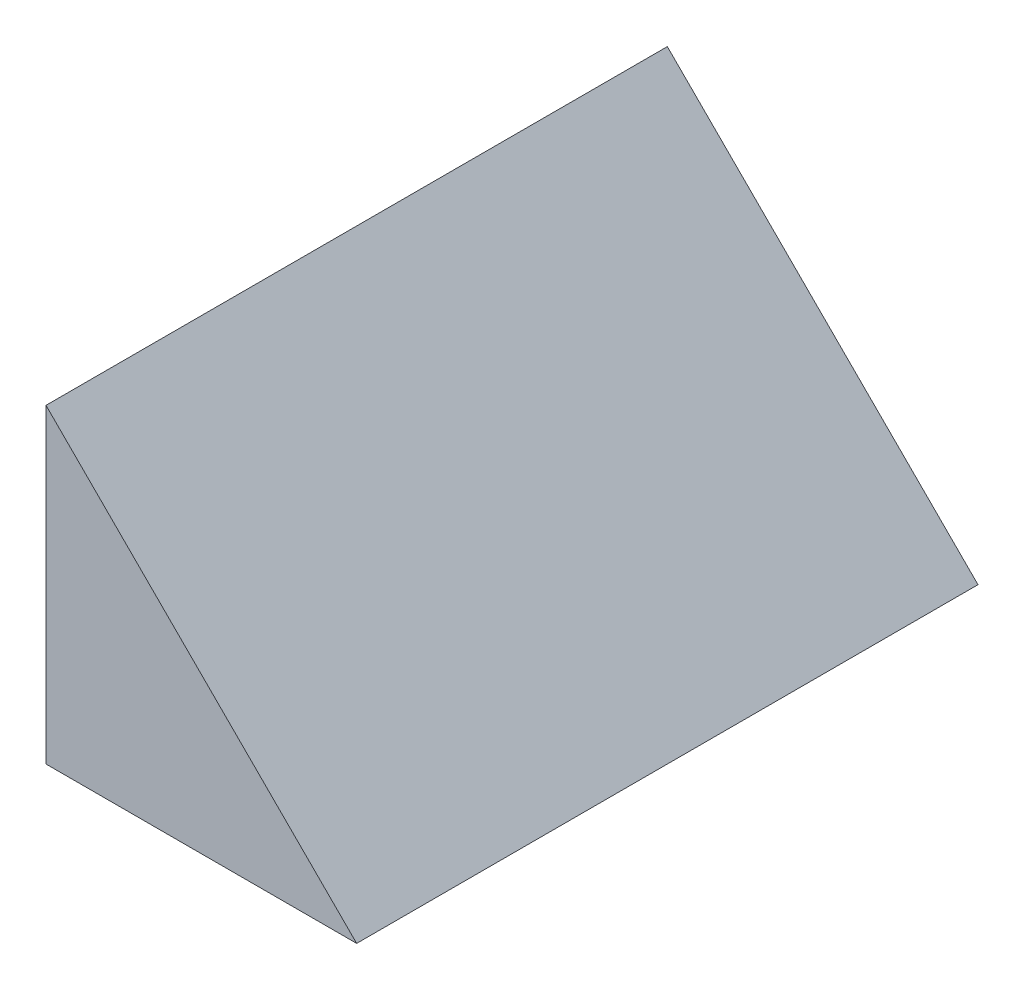
ISO-10303-21;
HEADER;
FILE_DESCRIPTION(('STEP AP214'),'2;1');
FILE_NAME('part.step','',(''),(''),'','','');
FILE_SCHEMA(('AUTOMOTIVE_DESIGN { 1 0 10303 214 1 1 1 1 }'));
ENDSEC;
DATA;
#1=APPLICATION_CONTEXT('core data for automotive mechanical design processes');
#2=APPLICATION_PROTOCOL_DEFINITION('international standard','automotive_design',2000,#1);
#3=PRODUCT_CONTEXT('',#1,'mechanical');
#4=PRODUCT('Part','Part','',(#3));
#5=PRODUCT_RELATED_PRODUCT_CATEGORY('part','',(#4));
#6=PRODUCT_DEFINITION_FORMATION('','',#4);
#7=PRODUCT_DEFINITION_CONTEXT('part definition',#1,'design');
#8=PRODUCT_DEFINITION('design','',#6,#7);
#9=PRODUCT_DEFINITION_SHAPE('','',#8);
#10=(LENGTH_UNIT() NAMED_UNIT(*) SI_UNIT(.MILLI.,.METRE.));
#11=(NAMED_UNIT(*) PLANE_ANGLE_UNIT() SI_UNIT($,.RADIAN.));
#12=(NAMED_UNIT(*) SI_UNIT($,.STERADIAN.) SOLID_ANGLE_UNIT());
#13=UNCERTAINTY_MEASURE_WITH_UNIT(LENGTH_MEASURE(1.E-05),#10,'distance_accuracy_value','');
#14=(GEOMETRIC_REPRESENTATION_CONTEXT(3) GLOBAL_UNCERTAINTY_ASSIGNED_CONTEXT((#13)) GLOBAL_UNIT_ASSIGNED_CONTEXT((#10,
#11,#12)) REPRESENTATION_CONTEXT('',''));
#15=CARTESIAN_POINT('',(0.,0.,0.));
#16=DIRECTION('',(0.,0.,1.));
#17=DIRECTION('',(1.,0.,0.));
#18=AXIS2_PLACEMENT_3D('',#15,#16,#17);
#19=CARTESIAN_POINT('',(0.,6.35,12.7));
#20=DIRECTION('',(1.,0.,0.));
#21=DIRECTION('',(0.,1.,0.));
#22=AXIS2_PLACEMENT_3D('',#19,#20,#21);
#23=PLANE('',#22);
#24=DIRECTION('',(0.,-1.,0.));
#25=VECTOR('',#24,1.);
#26=CARTESIAN_POINT('',(0.,6.35,0.));
#27=LINE('',#26,#25);
#28=CARTESIAN_POINT('',(0.,6.35,0.));
#29=VERTEX_POINT('',#28);
#30=CARTESIAN_POINT('',(0.,0.,0.));
#31=VERTEX_POINT('',#30);
#32=EDGE_CURVE('E79',#29,#31,#27,.T.);
#33=ORIENTED_EDGE('',*,*,#32,.T.);
#34=DIRECTION('',(0.,0.,-1.));
#35=VECTOR('',#34,1.);
#36=CARTESIAN_POINT('',(0.,0.,12.7));
#37=LINE('',#36,#35);
#38=CARTESIAN_POINT('',(0.,0.,12.7));
#39=VERTEX_POINT('',#38);
#40=EDGE_CURVE('E11',#39,#31,#37,.T.);
#41=ORIENTED_EDGE('',*,*,#40,.F.);
#42=DIRECTION('',(0.,-1.,0.));
#43=VECTOR('',#42,1.);
#44=CARTESIAN_POINT('',(0.,6.35,12.7));
#45=LINE('',#44,#43);
#46=CARTESIAN_POINT('',(0.,6.35,12.7));
#47=VERTEX_POINT('',#46);
#48=EDGE_CURVE('E72',#47,#39,#45,.T.);
#49=ORIENTED_EDGE('',*,*,#48,.F.);
#50=DIRECTION('',(0.,0.,-1.));
#51=VECTOR('',#50,1.);
#52=CARTESIAN_POINT('',(0.,6.35,12.7));
#53=LINE('',#52,#51);
#54=EDGE_CURVE('E80',#47,#29,#53,.T.);
#55=ORIENTED_EDGE('',*,*,#54,.T.);
#56=EDGE_LOOP('',(#33,#41,#49,#55));
#57=FACE_BOUND('',#56,.T.);
#58=ADVANCED_FACE('F32',(#57),#23,.F.);
#59=CARTESIAN_POINT('',(0.,0.,12.7));
#60=DIRECTION('',(0.,1.,0.));
#61=DIRECTION('',(0.,0.,1.));
#62=AXIS2_PLACEMENT_3D('',#59,#60,#61);
#63=PLANE('',#62);
#64=DIRECTION('',(1.,0.,0.));
#65=VECTOR('',#64,1.);
#66=CARTESIAN_POINT('',(0.,0.,0.));
#67=LINE('',#66,#65);
#68=CARTESIAN_POINT('',(6.35,0.,0.));
#69=VERTEX_POINT('',#68);
#70=EDGE_CURVE('E60',#31,#69,#67,.T.);
#71=ORIENTED_EDGE('',*,*,#70,.T.);
#72=DIRECTION('',(0.,0.,-1.));
#73=VECTOR('',#72,1.);
#74=CARTESIAN_POINT('',(6.35,0.,12.7));
#75=LINE('',#74,#73);
#76=CARTESIAN_POINT('',(6.35,0.,12.7));
#77=VERTEX_POINT('',#76);
#78=EDGE_CURVE('E40',#77,#69,#75,.T.);
#79=ORIENTED_EDGE('',*,*,#78,.F.);
#80=DIRECTION('',(1.,0.,0.));
#81=VECTOR('',#80,1.);
#82=CARTESIAN_POINT('',(0.,0.,12.7));
#83=LINE('',#82,#81);
#84=EDGE_CURVE('E68',#39,#77,#83,.T.);
#85=ORIENTED_EDGE('',*,*,#84,.F.);
#86=ORIENTED_EDGE('',*,*,#40,.T.);
#87=EDGE_LOOP('',(#71,#79,#85,#86));
#88=FACE_BOUND('',#87,.T.);
#89=ADVANCED_FACE('F69',(#88),#63,.F.);
#90=CARTESIAN_POINT('',(6.35,0.,12.7));
#91=DIRECTION('',(-0.707106781186548,-0.707106781186547,0.));
#92=DIRECTION('',(0.707106781186547,-0.707106781186548,0.));
#93=AXIS2_PLACEMENT_3D('',#90,#91,#92);
#94=PLANE('',#93);
#95=DIRECTION('',(-0.707106781186547,0.707106781186548,0.));
#96=VECTOR('',#95,1.);
#97=CARTESIAN_POINT('',(6.35,0.,0.));
#98=LINE('',#97,#96);
#99=EDGE_CURVE('E65',#69,#29,#98,.T.);
#100=ORIENTED_EDGE('',*,*,#99,.T.);
#101=ORIENTED_EDGE('',*,*,#54,.F.);
#102=DIRECTION('',(-0.707106781186547,0.707106781186548,0.));
#103=VECTOR('',#102,1.);
#104=CARTESIAN_POINT('',(6.35,0.,12.7));
#105=LINE('',#104,#103);
#106=EDGE_CURVE('E48',#77,#47,#105,.T.);
#107=ORIENTED_EDGE('',*,*,#106,.F.);
#108=ORIENTED_EDGE('',*,*,#78,.T.);
#109=EDGE_LOOP('',(#100,#101,#107,#108));
#110=FACE_BOUND('',#109,.T.);
#111=ADVANCED_FACE('F87',(#110),#94,.F.);
#112=CARTESIAN_POINT('',(0.,0.,12.7));
#113=DIRECTION('',(0.,0.,1.));
#114=DIRECTION('',(1.,0.,0.));
#115=AXIS2_PLACEMENT_3D('',#112,#113,#114);
#116=PLANE('',#115);
#117=ORIENTED_EDGE('',*,*,#48,.T.);
#118=ORIENTED_EDGE('',*,*,#84,.T.);
#119=ORIENTED_EDGE('',*,*,#106,.T.);
#120=EDGE_LOOP('',(#117,#118,#119));
#121=FACE_BOUND('',#120,.T.);
#122=ADVANCED_FACE('F75',(#121),#116,.T.);
#123=CARTESIAN_POINT('',(0.,0.,0.));
#124=DIRECTION('',(0.,0.,1.));
#125=DIRECTION('',(1.,0.,0.));
#126=AXIS2_PLACEMENT_3D('',#123,#124,#125);
#127=PLANE('',#126);
#128=ORIENTED_EDGE('',*,*,#32,.F.);
#129=ORIENTED_EDGE('',*,*,#99,.F.);
#130=ORIENTED_EDGE('',*,*,#70,.F.);
#131=EDGE_LOOP('',(#128,#129,#130));
#132=FACE_BOUND('',#131,.T.);
#133=ADVANCED_FACE('F88',(#132),#127,.F.);
#134=CLOSED_SHELL('',(#58,#89,#111,#122,#133));
#135=MANIFOLD_SOLID_BREP('B2',#134);
#136=ADVANCED_BREP_SHAPE_REPRESENTATION('',(#18,#135),#14);
#137=SHAPE_DEFINITION_REPRESENTATION(#9,#136);
ENDSEC;
END-ISO-10303-21;
